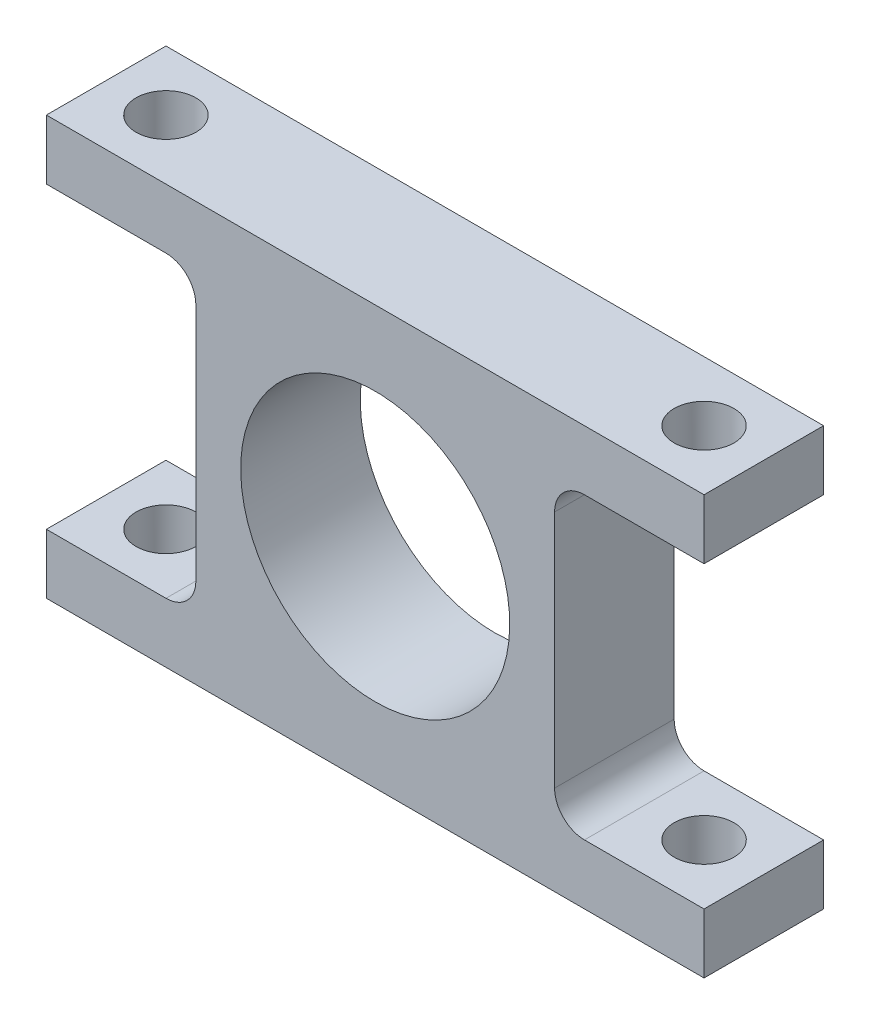
ISO-10303-21;
HEADER;
FILE_DESCRIPTION(('STEP AP214'),'2;1');
FILE_NAME('part.step','',(''),(''),'','','');
FILE_SCHEMA(('AUTOMOTIVE_DESIGN { 1 0 10303 214 1 1 1 1 }'));
ENDSEC;
DATA;
#1=APPLICATION_CONTEXT('core data for automotive mechanical design processes');
#2=APPLICATION_PROTOCOL_DEFINITION('international standard','automotive_design',2000,#1);
#3=PRODUCT_CONTEXT('',#1,'mechanical');
#4=PRODUCT('Part','Part','',(#3));
#5=PRODUCT_RELATED_PRODUCT_CATEGORY('part','',(#4));
#6=PRODUCT_DEFINITION_FORMATION('','',#4);
#7=PRODUCT_DEFINITION_CONTEXT('part definition',#1,'design');
#8=PRODUCT_DEFINITION('design','',#6,#7);
#9=PRODUCT_DEFINITION_SHAPE('','',#8);
#10=(LENGTH_UNIT() NAMED_UNIT(*) SI_UNIT(.MILLI.,.METRE.));
#11=(NAMED_UNIT(*) PLANE_ANGLE_UNIT() SI_UNIT($,.RADIAN.));
#12=(NAMED_UNIT(*) SI_UNIT($,.STERADIAN.) SOLID_ANGLE_UNIT());
#13=UNCERTAINTY_MEASURE_WITH_UNIT(LENGTH_MEASURE(1.E-05),#10,'distance_accuracy_value','');
#14=(GEOMETRIC_REPRESENTATION_CONTEXT(3) GLOBAL_UNCERTAINTY_ASSIGNED_CONTEXT((#13)) GLOBAL_UNIT_ASSIGNED_CONTEXT((#10,
#11,#12)) REPRESENTATION_CONTEXT('',''));
#15=CARTESIAN_POINT('',(0.,0.,0.));
#16=DIRECTION('',(0.,0.,1.));
#17=DIRECTION('',(1.,0.,0.));
#18=AXIS2_PLACEMENT_3D('',#15,#16,#17);
#19=CARTESIAN_POINT('',(22.,0.,8.));
#20=DIRECTION('',(-1.,0.,0.));
#21=DIRECTION('',(0.,0.,1.));
#22=AXIS2_PLACEMENT_3D('',#19,#20,#21);
#23=PLANE('',#22);
#24=DIRECTION('',(0.,1.,0.));
#25=VECTOR('',#24,1.);
#26=CARTESIAN_POINT('',(22.,0.,0.));
#27=LINE('',#26,#25);
#28=CARTESIAN_POINT('',(22.,0.,0.));
#29=VERTEX_POINT('',#28);
#30=CARTESIAN_POINT('',(22.,3.99999999999999,0.));
#31=VERTEX_POINT('',#30);
#32=EDGE_CURVE('E179',#29,#31,#27,.T.);
#33=ORIENTED_EDGE('',*,*,#32,.T.);
#34=DIRECTION('',(0.,0.,-1.));
#35=VECTOR('',#34,1.);
#36=CARTESIAN_POINT('',(22.,3.99999999999999,8.));
#37=LINE('',#36,#35);
#38=CARTESIAN_POINT('',(22.,3.99999999999999,8.));
#39=VERTEX_POINT('',#38);
#40=EDGE_CURVE('E158',#39,#31,#37,.T.);
#41=ORIENTED_EDGE('',*,*,#40,.F.);
#42=DIRECTION('',(0.,1.,0.));
#43=VECTOR('',#42,1.);
#44=CARTESIAN_POINT('',(22.,0.,8.));
#45=LINE('',#44,#43);
#46=CARTESIAN_POINT('',(22.,0.,8.));
#47=VERTEX_POINT('',#46);
#48=EDGE_CURVE('E166',#47,#39,#45,.T.);
#49=ORIENTED_EDGE('',*,*,#48,.F.);
#50=DIRECTION('',(0.,0.,-1.));
#51=VECTOR('',#50,1.);
#52=CARTESIAN_POINT('',(22.,0.,8.));
#53=LINE('',#52,#51);
#54=EDGE_CURVE('E276',#47,#29,#53,.T.);
#55=ORIENTED_EDGE('',*,*,#54,.T.);
#56=EDGE_LOOP('',(#33,#41,#49,#55));
#57=FACE_BOUND('',#56,.T.);
#58=ADVANCED_FACE('F39',(#57),#23,.F.);
#59=CARTESIAN_POINT('',(22.,3.99999999999999,8.));
#60=DIRECTION('',(0.,-1.,0.));
#61=DIRECTION('',(0.,0.,-1.));
#62=AXIS2_PLACEMENT_3D('',#59,#60,#61);
#63=PLANE('',#62);
#64=CARTESIAN_POINT('',(18.,3.99999999999999,4.));
#65=DIRECTION('',(0.,-1.,0.));
#66=DIRECTION('',(0.,0.,-1.));
#67=AXIS2_PLACEMENT_3D('',#64,#65,#66);
#68=CIRCLE('',#67,2.);
#69=CARTESIAN_POINT('',(18.,3.99999999999999,2.));
#70=VERTEX_POINT('',#69);
#71=EDGE_CURVE('E468',#70,#70,#68,.T.);
#72=ORIENTED_EDGE('',*,*,#71,.T.);
#73=EDGE_LOOP('',(#72));
#74=FACE_BOUND('',#73,.T.);
#75=DIRECTION('',(-1.,0.,0.));
#76=VECTOR('',#75,1.);
#77=CARTESIAN_POINT('',(22.,3.99999999999999,0.));
#78=LINE('',#77,#76);
#79=CARTESIAN_POINT('',(14.,3.99999999999999,0.));
#80=VERTEX_POINT('',#79);
#81=EDGE_CURVE('E321',#31,#80,#78,.T.);
#82=ORIENTED_EDGE('',*,*,#81,.T.);
#83=DIRECTION('',(0.,0.,-1.));
#84=VECTOR('',#83,1.);
#85=CARTESIAN_POINT('',(14.,3.99999999999999,8.));
#86=LINE('',#85,#84);
#87=CARTESIAN_POINT('',(14.,3.99999999999999,8.));
#88=VERTEX_POINT('',#87);
#89=EDGE_CURVE('E161',#80,#88,#86,.F.);
#90=ORIENTED_EDGE('',*,*,#89,.T.);
#91=DIRECTION('',(-1.,0.,0.));
#92=VECTOR('',#91,1.);
#93=CARTESIAN_POINT('',(22.,3.99999999999999,8.));
#94=LINE('',#93,#92);
#95=EDGE_CURVE('E153',#39,#88,#94,.T.);
#96=ORIENTED_EDGE('',*,*,#95,.F.);
#97=ORIENTED_EDGE('',*,*,#40,.T.);
#98=EDGE_LOOP('',(#82,#90,#96,#97));
#99=FACE_BOUND('',#98,.T.);
#100=ADVANCED_FACE('F156',(#74,#99),#63,.F.);
#101=CARTESIAN_POINT('',(12.,3.99999999999999,8.));
#102=DIRECTION('',(-1.,0.,0.));
#103=DIRECTION('',(0.,0.,1.));
#104=AXIS2_PLACEMENT_3D('',#101,#102,#103);
#105=PLANE('',#104);
#106=DIRECTION('',(0.,1.,0.));
#107=VECTOR('',#106,1.);
#108=CARTESIAN_POINT('',(12.,3.99999999999999,0.));
#109=LINE('',#108,#107);
#110=CARTESIAN_POINT('',(12.,5.99999999999999,0.));
#111=VERTEX_POINT('',#110);
#112=CARTESIAN_POINT('',(12.,22.,0.));
#113=VERTEX_POINT('',#112);
#114=EDGE_CURVE('E317',#111,#113,#109,.T.);
#115=ORIENTED_EDGE('',*,*,#114,.T.);
#116=DIRECTION('',(0.,0.,-1.));
#117=VECTOR('',#116,1.);
#118=CARTESIAN_POINT('',(12.,22.,8.));
#119=LINE('',#118,#117);
#120=CARTESIAN_POINT('',(12.,22.,8.));
#121=VERTEX_POINT('',#120);
#122=EDGE_CURVE('E197',#113,#121,#119,.F.);
#123=ORIENTED_EDGE('',*,*,#122,.T.);
#124=DIRECTION('',(0.,1.,0.));
#125=VECTOR('',#124,1.);
#126=CARTESIAN_POINT('',(12.,3.99999999999999,8.));
#127=LINE('',#126,#125);
#128=CARTESIAN_POINT('',(12.,5.99999999999999,8.));
#129=VERTEX_POINT('',#128);
#130=EDGE_CURVE('E165',#129,#121,#127,.T.);
#131=ORIENTED_EDGE('',*,*,#130,.F.);
#132=DIRECTION('',(0.,0.,-1.));
#133=VECTOR('',#132,1.);
#134=CARTESIAN_POINT('',(12.,5.99999999999999,0.));
#135=LINE('',#134,#133);
#136=EDGE_CURVE('E187',#129,#111,#135,.T.);
#137=ORIENTED_EDGE('',*,*,#136,.T.);
#138=EDGE_LOOP('',(#115,#123,#131,#137));
#139=FACE_BOUND('',#138,.T.);
#140=ADVANCED_FACE('F405',(#139),#105,.F.);
#141=CARTESIAN_POINT('',(12.,24.,8.));
#142=DIRECTION('',(0.,1.,0.));
#143=DIRECTION('',(0.,0.,1.));
#144=AXIS2_PLACEMENT_3D('',#141,#142,#143);
#145=PLANE('',#144);
#146=CARTESIAN_POINT('',(18.,24.,4.));
#147=DIRECTION('',(0.,1.,0.));
#148=DIRECTION('',(0.,0.,1.));
#149=AXIS2_PLACEMENT_3D('',#146,#147,#148);
#150=CIRCLE('',#149,2.);
#151=CARTESIAN_POINT('',(18.,24.,6.));
#152=VERTEX_POINT('',#151);
#153=EDGE_CURVE('E466',#152,#152,#150,.T.);
#154=ORIENTED_EDGE('',*,*,#153,.T.);
#155=EDGE_LOOP('',(#154));
#156=FACE_BOUND('',#155,.T.);
#157=DIRECTION('',(1.,0.,0.));
#158=VECTOR('',#157,1.);
#159=CARTESIAN_POINT('',(12.,24.,8.));
#160=LINE('',#159,#158);
#161=CARTESIAN_POINT('',(14.,24.,8.));
#162=VERTEX_POINT('',#161);
#163=CARTESIAN_POINT('',(22.,24.,8.));
#164=VERTEX_POINT('',#163);
#165=EDGE_CURVE('E344',#162,#164,#160,.T.);
#166=ORIENTED_EDGE('',*,*,#165,.F.);
#167=DIRECTION('',(0.,0.,-1.));
#168=VECTOR('',#167,1.);
#169=CARTESIAN_POINT('',(14.,24.,0.));
#170=LINE('',#169,#168);
#171=CARTESIAN_POINT('',(14.,24.,0.));
#172=VERTEX_POINT('',#171);
#173=EDGE_CURVE('E181',#162,#172,#170,.T.);
#174=ORIENTED_EDGE('',*,*,#173,.T.);
#175=DIRECTION('',(1.,0.,0.));
#176=VECTOR('',#175,1.);
#177=CARTESIAN_POINT('',(12.,24.,0.));
#178=LINE('',#177,#176);
#179=CARTESIAN_POINT('',(22.,24.,0.));
#180=VERTEX_POINT('',#179);
#181=EDGE_CURVE('E312',#172,#180,#178,.T.);
#182=ORIENTED_EDGE('',*,*,#181,.T.);
#183=DIRECTION('',(0.,0.,-1.));
#184=VECTOR('',#183,1.);
#185=CARTESIAN_POINT('',(22.,24.,8.));
#186=LINE('',#185,#184);
#187=EDGE_CURVE('E182',#164,#180,#186,.T.);
#188=ORIENTED_EDGE('',*,*,#187,.F.);
#189=EDGE_LOOP('',(#166,#174,#182,#188));
#190=FACE_BOUND('',#189,.T.);
#191=ADVANCED_FACE('F402',(#156,#190),#145,.F.);
#192=CARTESIAN_POINT('',(22.,24.,8.));
#193=DIRECTION('',(-1.,0.,0.));
#194=DIRECTION('',(0.,0.,1.));
#195=AXIS2_PLACEMENT_3D('',#192,#193,#194);
#196=PLANE('',#195);
#197=DIRECTION('',(0.,1.,0.));
#198=VECTOR('',#197,1.);
#199=CARTESIAN_POINT('',(22.,24.,0.));
#200=LINE('',#199,#198);
#201=CARTESIAN_POINT('',(22.,28.,0.));
#202=VERTEX_POINT('',#201);
#203=EDGE_CURVE('E307',#180,#202,#200,.T.);
#204=ORIENTED_EDGE('',*,*,#203,.T.);
#205=DIRECTION('',(0.,0.,-1.));
#206=VECTOR('',#205,1.);
#207=CARTESIAN_POINT('',(22.,28.,8.));
#208=LINE('',#207,#206);
#209=CARTESIAN_POINT('',(22.,28.,8.));
#210=VERTEX_POINT('',#209);
#211=EDGE_CURVE('E190',#210,#202,#208,.T.);
#212=ORIENTED_EDGE('',*,*,#211,.F.);
#213=DIRECTION('',(0.,1.,0.));
#214=VECTOR('',#213,1.);
#215=CARTESIAN_POINT('',(22.,24.,8.));
#216=LINE('',#215,#214);
#217=EDGE_CURVE('E341',#164,#210,#216,.T.);
#218=ORIENTED_EDGE('',*,*,#217,.F.);
#219=ORIENTED_EDGE('',*,*,#187,.T.);
#220=EDGE_LOOP('',(#204,#212,#218,#219));
#221=FACE_BOUND('',#220,.T.);
#222=ADVANCED_FACE('F398',(#221),#196,.F.);
#223=CARTESIAN_POINT('',(-22.,28.,8.));
#224=DIRECTION('',(0.,-1.,0.));
#225=DIRECTION('',(0.,0.,-1.));
#226=AXIS2_PLACEMENT_3D('',#223,#224,#225);
#227=PLANE('',#226);
#228=CARTESIAN_POINT('',(-18.,28.,4.));
#229=DIRECTION('',(0.,1.,0.));
#230=DIRECTION('',(0.,0.,1.));
#231=AXIS2_PLACEMENT_3D('',#228,#229,#230);
#232=CIRCLE('',#231,2.);
#233=CARTESIAN_POINT('',(-18.,28.,6.));
#234=VERTEX_POINT('',#233);
#235=EDGE_CURVE('E477',#234,#234,#232,.T.);
#236=ORIENTED_EDGE('',*,*,#235,.F.);
#237=EDGE_LOOP('',(#236));
#238=FACE_BOUND('',#237,.T.);
#239=CARTESIAN_POINT('',(18.,28.,4.));
#240=DIRECTION('',(0.,1.,0.));
#241=DIRECTION('',(0.,0.,-1.));
#242=AXIS2_PLACEMENT_3D('',#239,#240,#241);
#243=CIRCLE('',#242,2.);
#244=CARTESIAN_POINT('',(18.,28.,2.));
#245=VERTEX_POINT('',#244);
#246=EDGE_CURVE('E463',#245,#245,#243,.T.);
#247=ORIENTED_EDGE('',*,*,#246,.F.);
#248=EDGE_LOOP('',(#247));
#249=FACE_BOUND('',#248,.T.);
#250=DIRECTION('',(-1.,0.,0.));
#251=VECTOR('',#250,1.);
#252=CARTESIAN_POINT('',(-22.,28.,0.));
#253=LINE('',#252,#251);
#254=CARTESIAN_POINT('',(-22.,28.,0.));
#255=VERTEX_POINT('',#254);
#256=EDGE_CURVE('E300',#202,#255,#253,.T.);
#257=ORIENTED_EDGE('',*,*,#256,.T.);
#258=DIRECTION('',(0.,0.,-1.));
#259=VECTOR('',#258,1.);
#260=CARTESIAN_POINT('',(-22.,28.,8.));
#261=LINE('',#260,#259);
#262=CARTESIAN_POINT('',(-22.,28.,8.));
#263=VERTEX_POINT('',#262);
#264=EDGE_CURVE('E289',#263,#255,#261,.T.);
#265=ORIENTED_EDGE('',*,*,#264,.F.);
#266=DIRECTION('',(-1.,0.,0.));
#267=VECTOR('',#266,1.);
#268=CARTESIAN_POINT('',(-22.,28.,8.));
#269=LINE('',#268,#267);
#270=EDGE_CURVE('E301',#210,#263,#269,.T.);
#271=ORIENTED_EDGE('',*,*,#270,.F.);
#272=ORIENTED_EDGE('',*,*,#211,.T.);
#273=EDGE_LOOP('',(#257,#265,#271,#272));
#274=FACE_BOUND('',#273,.T.);
#275=ADVANCED_FACE('F298',(#238,#249,#274),#227,.F.);
#276=CARTESIAN_POINT('',(-22.,24.,8.));
#277=DIRECTION('',(1.,0.,0.));
#278=DIRECTION('',(0.,0.,-1.));
#279=AXIS2_PLACEMENT_3D('',#276,#277,#278);
#280=PLANE('',#279);
#281=DIRECTION('',(0.,-1.,0.));
#282=VECTOR('',#281,1.);
#283=CARTESIAN_POINT('',(-22.,24.,0.));
#284=LINE('',#283,#282);
#285=CARTESIAN_POINT('',(-22.,24.,0.));
#286=VERTEX_POINT('',#285);
#287=EDGE_CURVE('E268',#255,#286,#284,.T.);
#288=ORIENTED_EDGE('',*,*,#287,.T.);
#289=DIRECTION('',(0.,0.,-1.));
#290=VECTOR('',#289,1.);
#291=CARTESIAN_POINT('',(-22.,24.,8.));
#292=LINE('',#291,#290);
#293=CARTESIAN_POINT('',(-22.,24.,8.));
#294=VERTEX_POINT('',#293);
#295=EDGE_CURVE('E285',#294,#286,#292,.T.);
#296=ORIENTED_EDGE('',*,*,#295,.F.);
#297=DIRECTION('',(0.,-1.,0.));
#298=VECTOR('',#297,1.);
#299=CARTESIAN_POINT('',(-22.,24.,8.));
#300=LINE('',#299,#298);
#301=EDGE_CURVE('E336',#263,#294,#300,.T.);
#302=ORIENTED_EDGE('',*,*,#301,.F.);
#303=ORIENTED_EDGE('',*,*,#264,.T.);
#304=EDGE_LOOP('',(#288,#296,#302,#303));
#305=FACE_BOUND('',#304,.T.);
#306=ADVANCED_FACE('F391',(#305),#280,.F.);
#307=CARTESIAN_POINT('',(-12.,24.,8.));
#308=DIRECTION('',(0.,1.,0.));
#309=DIRECTION('',(0.,0.,1.));
#310=AXIS2_PLACEMENT_3D('',#307,#308,#309);
#311=PLANE('',#310);
#312=CARTESIAN_POINT('',(-18.,24.,4.));
#313=DIRECTION('',(0.,1.,0.));
#314=DIRECTION('',(0.,0.,1.));
#315=AXIS2_PLACEMENT_3D('',#312,#313,#314);
#316=CIRCLE('',#315,2.);
#317=CARTESIAN_POINT('',(-18.,24.,6.));
#318=VERTEX_POINT('',#317);
#319=EDGE_CURVE('E354',#318,#318,#316,.T.);
#320=ORIENTED_EDGE('',*,*,#319,.T.);
#321=EDGE_LOOP('',(#320));
#322=FACE_BOUND('',#321,.T.);
#323=DIRECTION('',(1.,0.,0.));
#324=VECTOR('',#323,1.);
#325=CARTESIAN_POINT('',(-12.,24.,0.));
#326=LINE('',#325,#324);
#327=CARTESIAN_POINT('',(-14.,24.,0.));
#328=VERTEX_POINT('',#327);
#329=EDGE_CURVE('E262',#286,#328,#326,.T.);
#330=ORIENTED_EDGE('',*,*,#329,.T.);
#331=DIRECTION('',(0.,0.,-1.));
#332=VECTOR('',#331,1.);
#333=CARTESIAN_POINT('',(-14.,24.,8.));
#334=LINE('',#333,#332);
#335=CARTESIAN_POINT('',(-14.,24.,8.));
#336=VERTEX_POINT('',#335);
#337=EDGE_CURVE('E55',#328,#336,#334,.F.);
#338=ORIENTED_EDGE('',*,*,#337,.T.);
#339=DIRECTION('',(1.,0.,0.));
#340=VECTOR('',#339,1.);
#341=CARTESIAN_POINT('',(-12.,24.,8.));
#342=LINE('',#341,#340);
#343=EDGE_CURVE('E333',#294,#336,#342,.T.);
#344=ORIENTED_EDGE('',*,*,#343,.F.);
#345=ORIENTED_EDGE('',*,*,#295,.T.);
#346=EDGE_LOOP('',(#330,#338,#344,#345));
#347=FACE_BOUND('',#346,.T.);
#348=ADVANCED_FACE('F388',(#322,#347),#311,.F.);
#349=CARTESIAN_POINT('',(-12.,3.99999999999999,8.));
#350=DIRECTION('',(1.,0.,0.));
#351=DIRECTION('',(0.,0.,-1.));
#352=AXIS2_PLACEMENT_3D('',#349,#350,#351);
#353=PLANE('',#352);
#354=DIRECTION('',(0.,-1.,0.));
#355=VECTOR('',#354,1.);
#356=CARTESIAN_POINT('',(-12.,3.99999999999999,0.));
#357=LINE('',#356,#355);
#358=CARTESIAN_POINT('',(-12.,22.,0.));
#359=VERTEX_POINT('',#358);
#360=CARTESIAN_POINT('',(-12.,5.99999999999999,0.));
#361=VERTEX_POINT('',#360);
#362=EDGE_CURVE('E255',#359,#361,#357,.T.);
#363=ORIENTED_EDGE('',*,*,#362,.T.);
#364=DIRECTION('',(0.,0.,-1.));
#365=VECTOR('',#364,1.);
#366=CARTESIAN_POINT('',(-12.,5.99999999999999,8.));
#367=LINE('',#366,#365);
#368=CARTESIAN_POINT('',(-12.,5.99999999999999,8.));
#369=VERTEX_POINT('',#368);
#370=EDGE_CURVE('E210',#361,#369,#367,.F.);
#371=ORIENTED_EDGE('',*,*,#370,.T.);
#372=DIRECTION('',(0.,-1.,0.));
#373=VECTOR('',#372,1.);
#374=CARTESIAN_POINT('',(-12.,3.99999999999999,8.));
#375=LINE('',#374,#373);
#376=CARTESIAN_POINT('',(-12.,22.,8.));
#377=VERTEX_POINT('',#376);
#378=EDGE_CURVE('E239',#377,#369,#375,.T.);
#379=ORIENTED_EDGE('',*,*,#378,.F.);
#380=DIRECTION('',(0.,0.,-1.));
#381=VECTOR('',#380,1.);
#382=CARTESIAN_POINT('',(-12.,22.,0.));
#383=LINE('',#382,#381);
#384=EDGE_CURVE('E206',#377,#359,#383,.T.);
#385=ORIENTED_EDGE('',*,*,#384,.T.);
#386=EDGE_LOOP('',(#363,#371,#379,#385));
#387=FACE_BOUND('',#386,.T.);
#388=ADVANCED_FACE('F259',(#387),#353,.F.);
#389=CARTESIAN_POINT('',(-22.,3.99999999999999,8.));
#390=DIRECTION('',(0.,-1.,0.));
#391=DIRECTION('',(0.,0.,-1.));
#392=AXIS2_PLACEMENT_3D('',#389,#390,#391);
#393=PLANE('',#392);
#394=CARTESIAN_POINT('',(-18.,3.99999999999999,4.));
#395=DIRECTION('',(0.,-1.,0.));
#396=DIRECTION('',(0.,0.,-1.));
#397=AXIS2_PLACEMENT_3D('',#394,#395,#396);
#398=CIRCLE('',#397,2.);
#399=CARTESIAN_POINT('',(-18.,3.99999999999999,2.));
#400=VERTEX_POINT('',#399);
#401=EDGE_CURVE('E474',#400,#400,#398,.T.);
#402=ORIENTED_EDGE('',*,*,#401,.T.);
#403=EDGE_LOOP('',(#402));
#404=FACE_BOUND('',#403,.T.);
#405=DIRECTION('',(-1.,0.,0.));
#406=VECTOR('',#405,1.);
#407=CARTESIAN_POINT('',(-22.,3.99999999999999,8.));
#408=LINE('',#407,#406);
#409=CARTESIAN_POINT('',(-14.,3.99999999999999,8.));
#410=VERTEX_POINT('',#409);
#411=CARTESIAN_POINT('',(-22.,3.99999999999999,8.));
#412=VERTEX_POINT('',#411);
#413=EDGE_CURVE('E236',#410,#412,#408,.T.);
#414=ORIENTED_EDGE('',*,*,#413,.F.);
#415=DIRECTION('',(0.,0.,-1.));
#416=VECTOR('',#415,1.);
#417=CARTESIAN_POINT('',(-14.,3.99999999999999,0.));
#418=LINE('',#417,#416);
#419=CARTESIAN_POINT('',(-14.,3.99999999999999,0.));
#420=VERTEX_POINT('',#419);
#421=EDGE_CURVE('E202',#410,#420,#418,.T.);
#422=ORIENTED_EDGE('',*,*,#421,.T.);
#423=DIRECTION('',(-1.,0.,0.));
#424=VECTOR('',#423,1.);
#425=CARTESIAN_POINT('',(-22.,3.99999999999999,0.));
#426=LINE('',#425,#424);
#427=CARTESIAN_POINT('',(-22.,3.99999999999999,0.));
#428=VERTEX_POINT('',#427);
#429=EDGE_CURVE('E257',#420,#428,#426,.T.);
#430=ORIENTED_EDGE('',*,*,#429,.T.);
#431=DIRECTION('',(0.,0.,-1.));
#432=VECTOR('',#431,1.);
#433=CARTESIAN_POINT('',(-22.,3.99999999999999,8.));
#434=LINE('',#433,#432);
#435=EDGE_CURVE('E247',#412,#428,#434,.T.);
#436=ORIENTED_EDGE('',*,*,#435,.F.);
#437=EDGE_LOOP('',(#414,#422,#430,#436));
#438=FACE_BOUND('',#437,.T.);
#439=ADVANCED_FACE('F244',(#404,#438),#393,.F.);
#440=CARTESIAN_POINT('',(-22.,0.,8.));
#441=DIRECTION('',(1.,0.,0.));
#442=DIRECTION('',(0.,0.,-1.));
#443=AXIS2_PLACEMENT_3D('',#440,#441,#442);
#444=PLANE('',#443);
#445=DIRECTION('',(0.,-1.,0.));
#446=VECTOR('',#445,1.);
#447=CARTESIAN_POINT('',(-22.,0.,0.));
#448=LINE('',#447,#446);
#449=CARTESIAN_POINT('',(-22.,0.,0.));
#450=VERTEX_POINT('',#449);
#451=EDGE_CURVE('E266',#428,#450,#448,.T.);
#452=ORIENTED_EDGE('',*,*,#451,.T.);
#453=DIRECTION('',(0.,0.,-1.));
#454=VECTOR('',#453,1.);
#455=CARTESIAN_POINT('',(-22.,0.,8.));
#456=LINE('',#455,#454);
#457=CARTESIAN_POINT('',(-22.,0.,8.));
#458=VERTEX_POINT('',#457);
#459=EDGE_CURVE('E279',#458,#450,#456,.T.);
#460=ORIENTED_EDGE('',*,*,#459,.F.);
#461=DIRECTION('',(0.,-1.,0.));
#462=VECTOR('',#461,1.);
#463=CARTESIAN_POINT('',(-22.,0.,8.));
#464=LINE('',#463,#462);
#465=EDGE_CURVE('E250',#412,#458,#464,.T.);
#466=ORIENTED_EDGE('',*,*,#465,.F.);
#467=ORIENTED_EDGE('',*,*,#435,.T.);
#468=EDGE_LOOP('',(#452,#460,#466,#467));
#469=FACE_BOUND('',#468,.T.);
#470=ADVANCED_FACE('F378',(#469),#444,.F.);
#471=CARTESIAN_POINT('',(22.,0.,8.));
#472=DIRECTION('',(0.,1.,0.));
#473=DIRECTION('',(0.,0.,1.));
#474=AXIS2_PLACEMENT_3D('',#471,#472,#473);
#475=PLANE('',#474);
#476=CARTESIAN_POINT('',(-18.,0.,4.));
#477=DIRECTION('',(0.,1.,0.));
#478=DIRECTION('',(0.,0.,1.));
#479=AXIS2_PLACEMENT_3D('',#476,#477,#478);
#480=CIRCLE('',#479,2.);
#481=CARTESIAN_POINT('',(-18.,0.,6.));
#482=VERTEX_POINT('',#481);
#483=EDGE_CURVE('E469',#482,#482,#480,.T.);
#484=ORIENTED_EDGE('',*,*,#483,.T.);
#485=EDGE_LOOP('',(#484));
#486=FACE_BOUND('',#485,.T.);
#487=CARTESIAN_POINT('',(18.,0.,4.));
#488=DIRECTION('',(0.,1.,0.));
#489=DIRECTION('',(0.,0.,-1.));
#490=AXIS2_PLACEMENT_3D('',#487,#488,#489);
#491=CIRCLE('',#490,2.);
#492=CARTESIAN_POINT('',(18.,0.,2.));
#493=VERTEX_POINT('',#492);
#494=EDGE_CURVE('E490',#493,#493,#491,.T.);
#495=ORIENTED_EDGE('',*,*,#494,.T.);
#496=EDGE_LOOP('',(#495));
#497=FACE_BOUND('',#496,.T.);
#498=DIRECTION('',(1.,0.,0.));
#499=VECTOR('',#498,1.);
#500=CARTESIAN_POINT('',(22.,0.,0.));
#501=LINE('',#500,#499);
#502=EDGE_CURVE('E176',#450,#29,#501,.T.);
#503=ORIENTED_EDGE('',*,*,#502,.T.);
#504=ORIENTED_EDGE('',*,*,#54,.F.);
#505=DIRECTION('',(1.,0.,0.));
#506=VECTOR('',#505,1.);
#507=CARTESIAN_POINT('',(22.,0.,8.));
#508=LINE('',#507,#506);
#509=EDGE_CURVE('E171',#458,#47,#508,.T.);
#510=ORIENTED_EDGE('',*,*,#509,.F.);
#511=ORIENTED_EDGE('',*,*,#459,.T.);
#512=EDGE_LOOP('',(#503,#504,#510,#511));
#513=FACE_BOUND('',#512,.T.);
#514=ADVANCED_FACE('F371',(#486,#497,#513),#475,.F.);
#515=CARTESIAN_POINT('',(0.,0.,8.));
#516=DIRECTION('',(0.,0.,1.));
#517=DIRECTION('',(1.,0.,0.));
#518=AXIS2_PLACEMENT_3D('',#515,#516,#517);
#519=PLANE('',#518);
#520=CARTESIAN_POINT('',(0.,14.,8.));
#521=DIRECTION('',(0.,0.,1.));
#522=DIRECTION('',(0.,-1.,0.));
#523=AXIS2_PLACEMENT_3D('',#520,#521,#522);
#524=ELLIPSE('',#523,9.,9.);
#525=CARTESIAN_POINT('',(0.,5.,8.));
#526=VERTEX_POINT('',#525);
#527=EDGE_CURVE('E350',#526,#526,#524,.T.);
#528=ORIENTED_EDGE('',*,*,#527,.F.);
#529=EDGE_LOOP('',(#528));
#530=FACE_BOUND('',#529,.T.);
#531=ORIENTED_EDGE('',*,*,#48,.T.);
#532=ORIENTED_EDGE('',*,*,#95,.T.);
#533=CARTESIAN_POINT('',(14.,5.99999999999999,8.));
#534=DIRECTION('',(0.,0.,1.));
#535=DIRECTION('',(1.,0.,0.));
#536=AXIS2_PLACEMENT_3D('',#533,#534,#535);
#537=CIRCLE('',#536,2.);
#538=EDGE_CURVE('E224',#88,#129,#537,.F.);
#539=ORIENTED_EDGE('',*,*,#538,.T.);
#540=ORIENTED_EDGE('',*,*,#130,.T.);
#541=CARTESIAN_POINT('',(14.,22.,8.));
#542=DIRECTION('',(0.,0.,1.));
#543=DIRECTION('',(1.,0.,0.));
#544=AXIS2_PLACEMENT_3D('',#541,#542,#543);
#545=CIRCLE('',#544,2.);
#546=EDGE_CURVE('E218',#121,#162,#545,.F.);
#547=ORIENTED_EDGE('',*,*,#546,.T.);
#548=ORIENTED_EDGE('',*,*,#165,.T.);
#549=ORIENTED_EDGE('',*,*,#217,.T.);
#550=ORIENTED_EDGE('',*,*,#270,.T.);
#551=ORIENTED_EDGE('',*,*,#301,.T.);
#552=ORIENTED_EDGE('',*,*,#343,.T.);
#553=CARTESIAN_POINT('',(-14.,22.,8.));
#554=DIRECTION('',(0.,0.,1.));
#555=DIRECTION('',(1.,0.,0.));
#556=AXIS2_PLACEMENT_3D('',#553,#554,#555);
#557=CIRCLE('',#556,2.);
#558=EDGE_CURVE('E11',#336,#377,#557,.F.);
#559=ORIENTED_EDGE('',*,*,#558,.T.);
#560=ORIENTED_EDGE('',*,*,#378,.T.);
#561=CARTESIAN_POINT('',(-14.,5.99999999999999,8.));
#562=DIRECTION('',(0.,0.,1.));
#563=DIRECTION('',(1.,0.,0.));
#564=AXIS2_PLACEMENT_3D('',#561,#562,#563);
#565=CIRCLE('',#564,2.);
#566=EDGE_CURVE('E230',#369,#410,#565,.F.);
#567=ORIENTED_EDGE('',*,*,#566,.T.);
#568=ORIENTED_EDGE('',*,*,#413,.T.);
#569=ORIENTED_EDGE('',*,*,#465,.T.);
#570=ORIENTED_EDGE('',*,*,#509,.T.);
#571=EDGE_LOOP('',(#531,#532,#539,#540,#547,#548,#549,#550,#551,#552,#559,#560,#567,#568,#569,#570));
#572=FACE_BOUND('',#571,.T.);
#573=ADVANCED_FACE('F169',(#530,#572),#519,.T.);
#574=CARTESIAN_POINT('',(0.,0.,0.));
#575=DIRECTION('',(0.,0.,1.));
#576=DIRECTION('',(1.,0.,0.));
#577=AXIS2_PLACEMENT_3D('',#574,#575,#576);
#578=PLANE('',#577);
#579=CARTESIAN_POINT('',(0.,14.,0.));
#580=DIRECTION('',(0.,0.,1.));
#581=DIRECTION('',(0.,-1.,0.));
#582=AXIS2_PLACEMENT_3D('',#579,#580,#581);
#583=ELLIPSE('',#582,9.,9.);
#584=CARTESIAN_POINT('',(0.,5.,0.));
#585=VERTEX_POINT('',#584);
#586=EDGE_CURVE('E326',#585,#585,#583,.T.);
#587=ORIENTED_EDGE('',*,*,#586,.T.);
#588=EDGE_LOOP('',(#587));
#589=FACE_BOUND('',#588,.T.);
#590=ORIENTED_EDGE('',*,*,#32,.F.);
#591=ORIENTED_EDGE('',*,*,#502,.F.);
#592=ORIENTED_EDGE('',*,*,#451,.F.);
#593=ORIENTED_EDGE('',*,*,#429,.F.);
#594=CARTESIAN_POINT('',(-14.,5.99999999999999,0.));
#595=DIRECTION('',(0.,0.,1.));
#596=DIRECTION('',(1.,0.,0.));
#597=AXIS2_PLACEMENT_3D('',#594,#595,#596);
#598=CIRCLE('',#597,2.);
#599=EDGE_CURVE('E227',#420,#361,#598,.T.);
#600=ORIENTED_EDGE('',*,*,#599,.T.);
#601=ORIENTED_EDGE('',*,*,#362,.F.);
#602=CARTESIAN_POINT('',(-14.,22.,0.));
#603=DIRECTION('',(0.,0.,1.));
#604=DIRECTION('',(1.,0.,0.));
#605=AXIS2_PLACEMENT_3D('',#602,#603,#604);
#606=CIRCLE('',#605,2.);
#607=EDGE_CURVE('E48',#359,#328,#606,.T.);
#608=ORIENTED_EDGE('',*,*,#607,.T.);
#609=ORIENTED_EDGE('',*,*,#329,.F.);
#610=ORIENTED_EDGE('',*,*,#287,.F.);
#611=ORIENTED_EDGE('',*,*,#256,.F.);
#612=ORIENTED_EDGE('',*,*,#203,.F.);
#613=ORIENTED_EDGE('',*,*,#181,.F.);
#614=CARTESIAN_POINT('',(14.,22.,0.));
#615=DIRECTION('',(0.,0.,1.));
#616=DIRECTION('',(1.,0.,0.));
#617=AXIS2_PLACEMENT_3D('',#614,#615,#616);
#618=CIRCLE('',#617,2.);
#619=EDGE_CURVE('E215',#172,#113,#618,.T.);
#620=ORIENTED_EDGE('',*,*,#619,.T.);
#621=ORIENTED_EDGE('',*,*,#114,.F.);
#622=CARTESIAN_POINT('',(14.,5.99999999999999,0.));
#623=DIRECTION('',(0.,0.,1.));
#624=DIRECTION('',(1.,0.,0.));
#625=AXIS2_PLACEMENT_3D('',#622,#623,#624);
#626=CIRCLE('',#625,2.);
#627=EDGE_CURVE('E221',#111,#80,#626,.T.);
#628=ORIENTED_EDGE('',*,*,#627,.T.);
#629=ORIENTED_EDGE('',*,*,#81,.F.);
#630=EDGE_LOOP('',(#590,#591,#592,#593,#600,#601,#608,#609,#610,#611,#612,#613,#620,#621,#628,#629));
#631=FACE_BOUND('',#630,.T.);
#632=ADVANCED_FACE('F254',(#589,#631),#578,.F.);
#633=DIRECTION('',(0.,0.,1.));
#634=VECTOR('',#633,1.);
#635=SURFACE_OF_LINEAR_EXTRUSION('',#583,#634);
#636=ORIENTED_EDGE('',*,*,#586,.F.);
#637=EDGE_LOOP('',(#636));
#638=FACE_BOUND('',#637,.T.);
#639=ORIENTED_EDGE('',*,*,#527,.T.);
#640=EDGE_LOOP('',(#639));
#641=FACE_BOUND('',#640,.T.);
#642=ADVANCED_FACE('F361',(#638,#641),#635,.F.);
#643=CARTESIAN_POINT('',(14.,22.,8.));
#644=DIRECTION('',(0.,0.,1.));
#645=DIRECTION('',(1.,0.,0.));
#646=AXIS2_PLACEMENT_3D('',#643,#644,#645);
#647=CYLINDRICAL_SURFACE('',#646,2.);
#648=ORIENTED_EDGE('',*,*,#546,.F.);
#649=ORIENTED_EDGE('',*,*,#122,.F.);
#650=ORIENTED_EDGE('',*,*,#619,.F.);
#651=ORIENTED_EDGE('',*,*,#173,.F.);
#652=EDGE_LOOP('',(#648,#649,#650,#651));
#653=FACE_BOUND('',#652,.T.);
#654=ADVANCED_FACE('F365',(#653),#647,.F.);
#655=CARTESIAN_POINT('',(14.,5.99999999999999,8.));
#656=DIRECTION('',(0.,0.,1.));
#657=DIRECTION('',(1.,0.,0.));
#658=AXIS2_PLACEMENT_3D('',#655,#656,#657);
#659=CYLINDRICAL_SURFACE('',#658,2.);
#660=ORIENTED_EDGE('',*,*,#538,.F.);
#661=ORIENTED_EDGE('',*,*,#89,.F.);
#662=ORIENTED_EDGE('',*,*,#627,.F.);
#663=ORIENTED_EDGE('',*,*,#136,.F.);
#664=EDGE_LOOP('',(#660,#661,#662,#663));
#665=FACE_BOUND('',#664,.T.);
#666=ADVANCED_FACE('F417',(#665),#659,.F.);
#667=CARTESIAN_POINT('',(-14.,5.99999999999999,8.));
#668=DIRECTION('',(0.,0.,1.));
#669=DIRECTION('',(1.,0.,0.));
#670=AXIS2_PLACEMENT_3D('',#667,#668,#669);
#671=CYLINDRICAL_SURFACE('',#670,2.);
#672=ORIENTED_EDGE('',*,*,#566,.F.);
#673=ORIENTED_EDGE('',*,*,#370,.F.);
#674=ORIENTED_EDGE('',*,*,#599,.F.);
#675=ORIENTED_EDGE('',*,*,#421,.F.);
#676=EDGE_LOOP('',(#672,#673,#674,#675));
#677=FACE_BOUND('',#676,.T.);
#678=ADVANCED_FACE('F252',(#677),#671,.F.);
#679=CARTESIAN_POINT('',(-14.,22.,8.));
#680=DIRECTION('',(0.,0.,1.));
#681=DIRECTION('',(1.,0.,0.));
#682=AXIS2_PLACEMENT_3D('',#679,#680,#681);
#683=CYLINDRICAL_SURFACE('',#682,2.);
#684=ORIENTED_EDGE('',*,*,#558,.F.);
#685=ORIENTED_EDGE('',*,*,#337,.F.);
#686=ORIENTED_EDGE('',*,*,#607,.F.);
#687=ORIENTED_EDGE('',*,*,#384,.F.);
#688=EDGE_LOOP('',(#684,#685,#686,#687));
#689=FACE_BOUND('',#688,.T.);
#690=ADVANCED_FACE('F41',(#689),#683,.F.);
#691=CARTESIAN_POINT('',(18.,0.,4.));
#692=DIRECTION('',(0.,1.,0.));
#693=DIRECTION('',(0.,0.,1.));
#694=AXIS2_PLACEMENT_3D('',#691,#692,#693);
#695=CYLINDRICAL_SURFACE('',#694,2.);
#696=ORIENTED_EDGE('',*,*,#494,.F.);
#697=EDGE_LOOP('',(#696));
#698=FACE_BOUND('',#697,.T.);
#699=ORIENTED_EDGE('',*,*,#71,.F.);
#700=EDGE_LOOP('',(#699));
#701=FACE_BOUND('',#700,.T.);
#702=ADVANCED_FACE('F367',(#698,#701),#695,.F.);
#703=CARTESIAN_POINT('',(-18.,0.,4.));
#704=DIRECTION('',(0.,1.,0.));
#705=DIRECTION('',(0.,0.,1.));
#706=AXIS2_PLACEMENT_3D('',#703,#704,#705);
#707=CYLINDRICAL_SURFACE('',#706,2.);
#708=ORIENTED_EDGE('',*,*,#483,.F.);
#709=EDGE_LOOP('',(#708));
#710=FACE_BOUND('',#709,.T.);
#711=ORIENTED_EDGE('',*,*,#401,.F.);
#712=EDGE_LOOP('',(#711));
#713=FACE_BOUND('',#712,.T.);
#714=ADVANCED_FACE('F429',(#710,#713),#707,.F.);
#715=ORIENTED_EDGE('',*,*,#235,.T.);
#716=EDGE_LOOP('',(#715));
#717=FACE_BOUND('',#716,.T.);
#718=ORIENTED_EDGE('',*,*,#319,.F.);
#719=EDGE_LOOP('',(#718));
#720=FACE_BOUND('',#719,.T.);
#721=ADVANCED_FACE('F450',(#717,#720),#707,.F.);
#722=ORIENTED_EDGE('',*,*,#246,.T.);
#723=EDGE_LOOP('',(#722));
#724=FACE_BOUND('',#723,.T.);
#725=ORIENTED_EDGE('',*,*,#153,.F.);
#726=EDGE_LOOP('',(#725));
#727=FACE_BOUND('',#726,.T.);
#728=ADVANCED_FACE('F431',(#724,#727),#695,.F.);
#729=CLOSED_SHELL('',(#58,#100,#140,#191,#222,#275,#306,#348,#388,#439,#470,#514,#573,#632,#642,
#654,#666,#678,#690,#702,#714,#721,#728));
#730=MANIFOLD_SOLID_BREP('B2',#729);
#731=ADVANCED_BREP_SHAPE_REPRESENTATION('',(#18,#730),#14);
#732=SHAPE_DEFINITION_REPRESENTATION(#9,#731);
ENDSEC;
END-ISO-10303-21;
